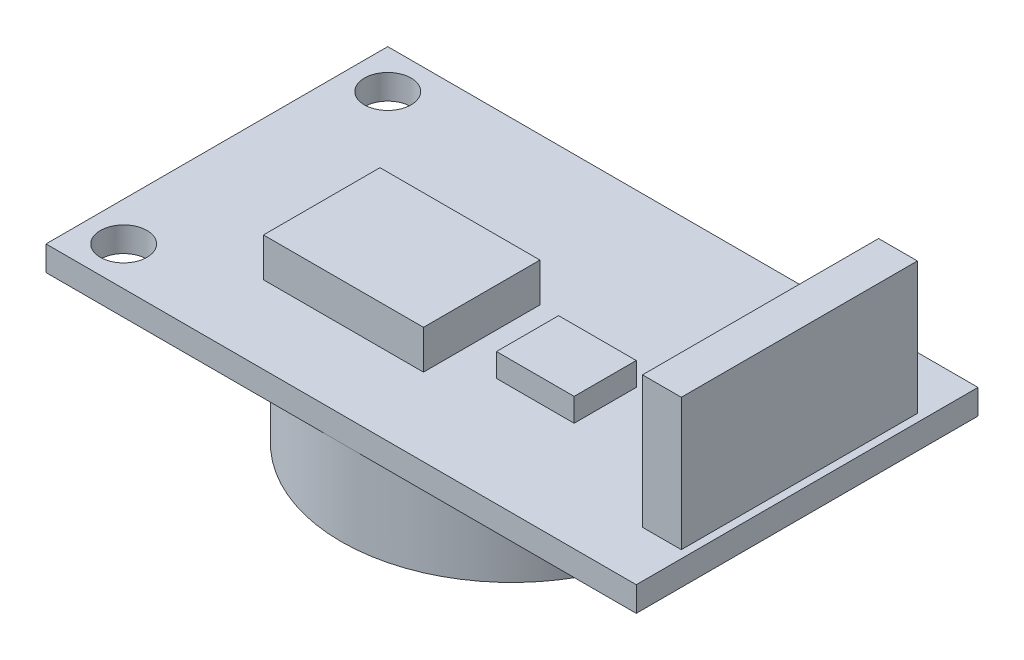
ISO-10303-21;
HEADER;
FILE_DESCRIPTION(('STEP AP214'),'2;1');
FILE_NAME('part.step','',(''),(''),'','','');
FILE_SCHEMA(('AUTOMOTIVE_DESIGN { 1 0 10303 214 1 1 1 1 }'));
ENDSEC;
DATA;
#1=APPLICATION_CONTEXT('core data for automotive mechanical design processes');
#2=APPLICATION_PROTOCOL_DEFINITION('international standard','automotive_design',2000,#1);
#3=PRODUCT_CONTEXT('',#1,'mechanical');
#4=PRODUCT('Part','Part','',(#3));
#5=PRODUCT_RELATED_PRODUCT_CATEGORY('part','',(#4));
#6=PRODUCT_DEFINITION_FORMATION('','',#4);
#7=PRODUCT_DEFINITION_CONTEXT('part definition',#1,'design');
#8=PRODUCT_DEFINITION('design','',#6,#7);
#9=PRODUCT_DEFINITION_SHAPE('','',#8);
#10=(LENGTH_UNIT() NAMED_UNIT(*) SI_UNIT(.MILLI.,.METRE.));
#11=(NAMED_UNIT(*) PLANE_ANGLE_UNIT() SI_UNIT($,.RADIAN.));
#12=(NAMED_UNIT(*) SI_UNIT($,.STERADIAN.) SOLID_ANGLE_UNIT());
#13=UNCERTAINTY_MEASURE_WITH_UNIT(LENGTH_MEASURE(1.E-05),#10,'distance_accuracy_value','');
#14=(GEOMETRIC_REPRESENTATION_CONTEXT(3) GLOBAL_UNCERTAINTY_ASSIGNED_CONTEXT((#13)) GLOBAL_UNIT_ASSIGNED_CONTEXT((#10,
#11,#12)) REPRESENTATION_CONTEXT('',''));
#15=CARTESIAN_POINT('',(0.,0.,0.));
#16=DIRECTION('',(0.,0.,1.));
#17=DIRECTION('',(1.,0.,0.));
#18=AXIS2_PLACEMENT_3D('',#15,#16,#17);
#19=CARTESIAN_POINT('',(0.,0.,0.));
#20=DIRECTION('',(0.,-1.,0.));
#21=DIRECTION('',(0.,0.,-1.));
#22=AXIS2_PLACEMENT_3D('',#19,#20,#21);
#23=PLANE('',#22);
#24=DIRECTION('',(1.,0.,0.));
#25=VECTOR('',#24,1.);
#26=CARTESIAN_POINT('',(0.,0.,0.));
#27=LINE('',#26,#25);
#28=CARTESIAN_POINT('',(19.,0.,0.));
#29=VERTEX_POINT('',#28);
#30=CARTESIAN_POINT('',(38.,0.,0.));
#31=VERTEX_POINT('',#30);
#32=EDGE_CURVE('E178',#29,#31,#27,.T.);
#33=ORIENTED_EDGE('',*,*,#32,.F.);
#34=CARTESIAN_POINT('',(19.,0.,-11.));
#35=DIRECTION('',(0.,1.,0.));
#36=DIRECTION('',(0.,0.,1.));
#37=AXIS2_PLACEMENT_3D('',#34,#35,#36);
#38=CIRCLE('',#37,11.);
#39=CARTESIAN_POINT('',(19.,0.,-22.));
#40=VERTEX_POINT('',#39);
#41=EDGE_CURVE('E62',#29,#40,#38,.T.);
#42=ORIENTED_EDGE('',*,*,#41,.T.);
#43=DIRECTION('',(-1.,0.,0.));
#44=VECTOR('',#43,1.);
#45=CARTESIAN_POINT('',(0.,0.,-22.));
#46=LINE('',#45,#44);
#47=CARTESIAN_POINT('',(38.,0.,-22.));
#48=VERTEX_POINT('',#47);
#49=EDGE_CURVE('E180',#48,#40,#46,.T.);
#50=ORIENTED_EDGE('',*,*,#49,.F.);
#51=DIRECTION('',(0.,0.,-1.));
#52=VECTOR('',#51,1.);
#53=CARTESIAN_POINT('',(38.,0.,0.));
#54=LINE('',#53,#52);
#55=EDGE_CURVE('E195',#31,#48,#54,.T.);
#56=ORIENTED_EDGE('',*,*,#55,.F.);
#57=EDGE_LOOP('',(#33,#42,#50,#56));
#58=FACE_BOUND('',#57,.T.);
#59=ADVANCED_FACE('F47',(#58),#23,.T.);
#60=CARTESIAN_POINT('',(0.,1.6,0.));
#61=DIRECTION('',(0.,-1.,0.));
#62=DIRECTION('',(0.,0.,-1.));
#63=AXIS2_PLACEMENT_3D('',#60,#61,#62);
#64=PLANE('',#63);
#65=DIRECTION('',(0.,0.,1.));
#66=VECTOR('',#65,1.);
#67=CARTESIAN_POINT('',(22.,1.6,-7.));
#68=LINE('',#67,#66);
#69=CARTESIAN_POINT('',(22.,1.6,-11.));
#70=VERTEX_POINT('',#69);
#71=CARTESIAN_POINT('',(22.,1.6,-7.));
#72=VERTEX_POINT('',#71);
#73=EDGE_CURVE('E677',#70,#72,#68,.T.);
#74=ORIENTED_EDGE('',*,*,#73,.F.);
#75=DIRECTION('',(-1.,0.,0.));
#76=VECTOR('',#75,1.);
#77=CARTESIAN_POINT('',(22.,1.6,-11.));
#78=LINE('',#77,#76);
#79=CARTESIAN_POINT('',(27.,1.6,-11.));
#80=VERTEX_POINT('',#79);
#81=EDGE_CURVE('E664',#80,#70,#78,.T.);
#82=ORIENTED_EDGE('',*,*,#81,.F.);
#83=DIRECTION('',(0.,0.,-1.));
#84=VECTOR('',#83,1.);
#85=CARTESIAN_POINT('',(27.,1.6,-7.));
#86=LINE('',#85,#84);
#87=CARTESIAN_POINT('',(27.,1.6,-7.));
#88=VERTEX_POINT('',#87);
#89=EDGE_CURVE('E667',#88,#80,#86,.T.);
#90=ORIENTED_EDGE('',*,*,#89,.F.);
#91=DIRECTION('',(1.,0.,0.));
#92=VECTOR('',#91,1.);
#93=CARTESIAN_POINT('',(22.,1.6,-7.));
#94=LINE('',#93,#92);
#95=EDGE_CURVE('E675',#72,#88,#94,.T.);
#96=ORIENTED_EDGE('',*,*,#95,.F.);
#97=EDGE_LOOP('',(#74,#82,#90,#96));
#98=FACE_BOUND('',#97,.T.);
#99=DIRECTION('',(0.,0.,1.));
#100=VECTOR('',#99,1.);
#101=CARTESIAN_POINT('',(0.,1.6,0.));
#102=LINE('',#101,#100);
#103=CARTESIAN_POINT('',(0.,1.6,-22.));
#104=VERTEX_POINT('',#103);
#105=CARTESIAN_POINT('',(0.,1.6,0.));
#106=VERTEX_POINT('',#105);
#107=EDGE_CURVE('E199',#104,#106,#102,.T.);
#108=ORIENTED_EDGE('',*,*,#107,.T.);
#109=DIRECTION('',(1.,0.,0.));
#110=VECTOR('',#109,1.);
#111=CARTESIAN_POINT('',(0.,1.6,0.));
#112=LINE('',#111,#110);
#113=CARTESIAN_POINT('',(38.,1.6,0.));
#114=VERTEX_POINT('',#113);
#115=EDGE_CURVE('E201',#106,#114,#112,.T.);
#116=ORIENTED_EDGE('',*,*,#115,.T.);
#117=DIRECTION('',(0.,0.,-1.));
#118=VECTOR('',#117,1.);
#119=CARTESIAN_POINT('',(38.,1.6,0.));
#120=LINE('',#119,#118);
#121=CARTESIAN_POINT('',(38.,1.6,-22.));
#122=VERTEX_POINT('',#121);
#123=EDGE_CURVE('E766',#114,#122,#120,.T.);
#124=ORIENTED_EDGE('',*,*,#123,.T.);
#125=DIRECTION('',(-1.,0.,0.));
#126=VECTOR('',#125,1.);
#127=CARTESIAN_POINT('',(0.,1.6,-22.));
#128=LINE('',#127,#126);
#129=EDGE_CURVE('E211',#122,#104,#128,.T.);
#130=ORIENTED_EDGE('',*,*,#129,.T.);
#131=EDGE_LOOP('',(#108,#116,#124,#130));
#132=FACE_BOUND('',#131,.T.);
#133=CARTESIAN_POINT('',(2.5,1.6,-19.5));
#134=DIRECTION('',(0.,1.,0.));
#135=DIRECTION('',(0.,0.,1.));
#136=AXIS2_PLACEMENT_3D('',#133,#134,#135);
#137=CIRCLE('',#136,1.5);
#138=CARTESIAN_POINT('',(2.5,1.6,-18.));
#139=VERTEX_POINT('',#138);
#140=EDGE_CURVE('E226',#139,#139,#137,.T.);
#141=ORIENTED_EDGE('',*,*,#140,.F.);
#142=EDGE_LOOP('',(#141));
#143=FACE_BOUND('',#142,.T.);
#144=CARTESIAN_POINT('',(2.5,1.6,-2.5));
#145=DIRECTION('',(0.,1.,0.));
#146=DIRECTION('',(0.,0.,1.));
#147=AXIS2_PLACEMENT_3D('',#144,#145,#146);
#148=CIRCLE('',#147,1.5);
#149=CARTESIAN_POINT('',(2.5,1.6,-1.));
#150=VERTEX_POINT('',#149);
#151=EDGE_CURVE('E240',#150,#150,#148,.T.);
#152=ORIENTED_EDGE('',*,*,#151,.F.);
#153=EDGE_LOOP('',(#152));
#154=FACE_BOUND('',#153,.T.);
#155=DIRECTION('',(0.,0.,1.));
#156=VECTOR('',#155,1.);
#157=CARTESIAN_POINT('',(9.,1.6,-5.));
#158=LINE('',#157,#156);
#159=CARTESIAN_POINT('',(9.,1.6,-12.5));
#160=VERTEX_POINT('',#159);
#161=CARTESIAN_POINT('',(9.,1.6,-5.));
#162=VERTEX_POINT('',#161);
#163=EDGE_CURVE('E632',#160,#162,#158,.T.);
#164=ORIENTED_EDGE('',*,*,#163,.F.);
#165=DIRECTION('',(-1.,0.,0.));
#166=VECTOR('',#165,1.);
#167=CARTESIAN_POINT('',(9.,1.6,-12.5));
#168=LINE('',#167,#166);
#169=CARTESIAN_POINT('',(19.3,1.6,-12.5));
#170=VERTEX_POINT('',#169);
#171=EDGE_CURVE('E618',#170,#160,#168,.T.);
#172=ORIENTED_EDGE('',*,*,#171,.F.);
#173=DIRECTION('',(0.,0.,-1.));
#174=VECTOR('',#173,1.);
#175=CARTESIAN_POINT('',(19.3,1.6,-5.));
#176=LINE('',#175,#174);
#177=CARTESIAN_POINT('',(19.3,1.6,-5.));
#178=VERTEX_POINT('',#177);
#179=EDGE_CURVE('E621',#178,#170,#176,.T.);
#180=ORIENTED_EDGE('',*,*,#179,.F.);
#181=DIRECTION('',(1.,0.,0.));
#182=VECTOR('',#181,1.);
#183=CARTESIAN_POINT('',(9.,1.6,-5.));
#184=LINE('',#183,#182);
#185=EDGE_CURVE('E630',#162,#178,#184,.T.);
#186=ORIENTED_EDGE('',*,*,#185,.F.);
#187=EDGE_LOOP('',(#164,#172,#180,#186));
#188=FACE_BOUND('',#187,.T.);
#189=DIRECTION('',(0.,0.,1.));
#190=VECTOR('',#189,1.);
#191=CARTESIAN_POINT('',(35.,1.6,-3.4));
#192=LINE('',#191,#190);
#193=CARTESIAN_POINT('',(35.,1.6,-18.6));
#194=VERTEX_POINT('',#193);
#195=CARTESIAN_POINT('',(35.,1.6,-3.4));
#196=VERTEX_POINT('',#195);
#197=EDGE_CURVE('E719',#194,#196,#192,.T.);
#198=ORIENTED_EDGE('',*,*,#197,.F.);
#199=DIRECTION('',(-1.,0.,0.));
#200=VECTOR('',#199,1.);
#201=CARTESIAN_POINT('',(35.,1.6,-18.6));
#202=LINE('',#201,#200);
#203=CARTESIAN_POINT('',(37.5,1.6,-18.6));
#204=VERTEX_POINT('',#203);
#205=EDGE_CURVE('E710',#204,#194,#202,.T.);
#206=ORIENTED_EDGE('',*,*,#205,.F.);
#207=DIRECTION('',(0.,0.,-1.));
#208=VECTOR('',#207,1.);
#209=CARTESIAN_POINT('',(37.5,1.6,-3.4));
#210=LINE('',#209,#208);
#211=CARTESIAN_POINT('',(37.5,1.6,-3.4));
#212=VERTEX_POINT('',#211);
#213=EDGE_CURVE('E715',#212,#204,#210,.T.);
#214=ORIENTED_EDGE('',*,*,#213,.F.);
#215=DIRECTION('',(1.,0.,0.));
#216=VECTOR('',#215,1.);
#217=CARTESIAN_POINT('',(35.,1.6,-3.4));
#218=LINE('',#217,#216);
#219=EDGE_CURVE('E73',#196,#212,#218,.T.);
#220=ORIENTED_EDGE('',*,*,#219,.F.);
#221=EDGE_LOOP('',(#198,#206,#214,#220));
#222=FACE_BOUND('',#221,.T.);
#223=ADVANCED_FACE('F260',(#98,#132,#143,#154,#188,#222),#64,.F.);
#224=CARTESIAN_POINT('',(2.5,0.,-2.5));
#225=DIRECTION('',(0.,-1.,0.));
#226=DIRECTION('',(0.,0.,-1.));
#227=AXIS2_PLACEMENT_3D('',#224,#225,#226);
#228=CIRCLE('',#227,1.5);
#229=CARTESIAN_POINT('',(2.5,0.,-4.));
#230=VERTEX_POINT('',#229);
#231=EDGE_CURVE('E232',#230,#230,#228,.T.);
#232=ORIENTED_EDGE('',*,*,#231,.F.);
#233=EDGE_LOOP('',(#232));
#234=FACE_BOUND('',#233,.T.);
#235=CARTESIAN_POINT('',(0.,0.,-22.));
#236=VERTEX_POINT('',#235);
#237=EDGE_CURVE('E181',#40,#236,#46,.T.);
#238=ORIENTED_EDGE('',*,*,#237,.F.);
#239=EDGE_CURVE('E11',#40,#29,#38,.T.);
#240=ORIENTED_EDGE('',*,*,#239,.T.);
#241=CARTESIAN_POINT('',(0.,0.,0.));
#242=VERTEX_POINT('',#241);
#243=EDGE_CURVE('E763',#242,#29,#27,.T.);
#244=ORIENTED_EDGE('',*,*,#243,.F.);
#245=DIRECTION('',(0.,0.,1.));
#246=VECTOR('',#245,1.);
#247=CARTESIAN_POINT('',(0.,0.,0.));
#248=LINE('',#247,#246);
#249=EDGE_CURVE('E190',#236,#242,#248,.T.);
#250=ORIENTED_EDGE('',*,*,#249,.F.);
#251=EDGE_LOOP('',(#238,#240,#244,#250));
#252=FACE_BOUND('',#251,.T.);
#253=CARTESIAN_POINT('',(2.5,0.,-18.));
#254=CARTESIAN_POINT('',(2.52473476852,0.,-17.9999980826802));
#255=CARTESIAN_POINT('',(2.54947077852716,0.,-18.0005895208856));
#256=CARTESIAN_POINT('',(2.59871128510739,0.,-18.0029702628292));
#257=CARTESIAN_POINT('',(2.62321619008211,0.,-18.0047511511846));
#258=CARTESIAN_POINT('',(2.67199479323806,0.,-18.0095103395863));
#259=CARTESIAN_POINT('',(2.6962690366817,0.,-18.0124830301223));
#260=CARTESIAN_POINT('',(2.74458604299784,0.,-18.0196223185799));
#261=CARTESIAN_POINT('',(2.76862920150763,0.,-18.023786237845));
#262=CARTESIAN_POINT('',(2.81648427918302,0.,-18.0333052012687));
#263=CARTESIAN_POINT('',(2.84029614420012,0.,-18.0386605176519));
#264=CARTESIAN_POINT('',(2.88768916254991,0.,-18.0505591453594));
#265=CARTESIAN_POINT('',(2.9112695224784,0.,-18.0571056152043));
#266=CARTESIAN_POINT('',(2.9582001930641,0.,-18.0713841370317));
#267=CARTESIAN_POINT('',(2.98154870748044,0.,-18.0791220881609));
#268=CARTESIAN_POINT('',(3.028017236187,0.,-18.0957791895752));
#269=CARTESIAN_POINT('',(3.05113423399122,0.,-18.1047067440334));
#270=CARTESIAN_POINT('',(3.09686336053341,0.,-18.1236328462025));
#271=CARTESIAN_POINT('',(3.11947652911205,0.,-18.1336288808047));
#272=CARTESIAN_POINT('',(3.16403406458057,0.,-18.1546460447498));
#273=CARTESIAN_POINT('',(3.18598193419839,0.,-18.1656597395946));
#274=CARTESIAN_POINT('',(3.22921011776657,0.,-18.1887078701629));
#275=CARTESIAN_POINT('',(3.25049296316425,0.,-18.200737556271));
#276=CARTESIAN_POINT('',(3.2923920024613,0.,-18.2258153814979));
#277=CARTESIAN_POINT('',(3.31300944998634,0.,-18.2388614255842));
#278=CARTESIAN_POINT('',(3.35357904909041,0.,-18.2659692031196));
#279=CARTESIAN_POINT('',(3.37353089224189,0.,-18.2800313981334));
#280=CARTESIAN_POINT('',(3.41277098771478,0.,-18.3091688454873));
#281=CARTESIAN_POINT('',(3.43205712992969,0.,-18.3242469388037));
#282=CARTESIAN_POINT('',(3.46996730836329,0.,-18.3554142625526));
#283=CARTESIAN_POINT('',(3.48858724864162,0.,-18.3715084726157));
#284=CARTESIAN_POINT('',(3.52516839349336,0.,-18.4047043306772));
#285=CARTESIAN_POINT('',(3.5431234128518,0.,-18.4218127889285));
#286=CARTESIAN_POINT('',(3.57814252919736,0.,-18.456812496153));
#287=CARTESIAN_POINT('',(3.59520921716565,0.,-18.4747011521589));
#288=CARTESIAN_POINT('',(3.62833220882851,0.,-18.5111697936336));
#289=CARTESIAN_POINT('',(3.64439459506989,0.,-18.5297442495727));
#290=CARTESIAN_POINT('',(3.67551206025717,0.,-18.5675806863676));
#291=CARTESIAN_POINT('',(3.69057129531407,0.,-18.5868392481338));
#292=CARTESIAN_POINT('',(3.71968410022349,0.,-18.6260421974699));
#293=CARTESIAN_POINT('',(3.73373963003835,0.,-18.645985129195));
#294=CARTESIAN_POINT('',(3.76084735271743,0.,-18.6865547656848));
#295=CARTESIAN_POINT('',(3.77389908400034,0.,-18.7071817788478));
#296=CARTESIAN_POINT('',(3.79900178729573,0.,-18.7491178039132));
#297=CARTESIAN_POINT('',(3.81104972262633,0.,-18.7704286330358));
#298=CARTESIAN_POINT('',(3.83414694196377,0.,-18.8137310828957));
#299=CARTESIAN_POINT('',(3.84519053619442,0.,-18.8357257367621));
#300=CARTESIAN_POINT('',(3.86628360233907,0.,-18.8803937086171));
#301=CARTESIAN_POINT('',(3.87632475368798,0.,-18.9030709514805));
#302=CARTESIAN_POINT('',(3.89528439042207,0.,-18.948807700282));
#303=CARTESIAN_POINT('',(3.90420626184726,0.,-18.9718658021565));
#304=CARTESIAN_POINT('',(3.92085197100997,0.,-19.01823405373));
#305=CARTESIAN_POINT('',(3.92858354434745,0.,-19.0415414224996));
#306=CARTESIAN_POINT('',(3.94285295603563,0.,-19.0884058704227));
#307=CARTESIAN_POINT('',(3.94939594256118,0.,-19.1119613812241));
#308=CARTESIAN_POINT('',(3.96129034794042,0.,-19.1593211718381));
#309=CARTESIAN_POINT('',(3.9666441346909,0.,-19.1831248566705));
#310=CARTESIAN_POINT('',(3.97616307710533,0.,-19.2309799898233));
#311=CARTESIAN_POINT('',(3.9803276883048,0.,-19.2550315464271));
#312=CARTESIAN_POINT('',(3.98747134007836,0.,-19.3033817703186));
#313=CARTESIAN_POINT('',(3.99044687970416,0.,-19.3276809544111));
#314=CARTESIAN_POINT('',(3.99521479776574,0.,-19.3765261247185));
#315=CARTESIAN_POINT('',(3.99700075880555,0.,-19.4010727357961));
#316=CARTESIAN_POINT('',(3.99939451810823,0.,-19.4504125277033));
#317=CARTESIAN_POINT('',(3.99999312718683,0.,-19.4752061505017));
#318=CARTESIAN_POINT('',(4.00000685149273,0.,-19.5247169354649));
#319=CARTESIAN_POINT('',(3.99942563232503,0.,-19.5494340962254));
#320=CARTESIAN_POINT('',(3.99705990065969,0.,-19.598642811929));
#321=CARTESIAN_POINT('',(3.99528359914018,0.,-19.6231347579143));
#322=CARTESIAN_POINT('',(3.99053256875276,0.,-19.6718925295955));
#323=CARTESIAN_POINT('',(3.98756319636062,0.,-19.6961588764443));
#324=CARTESIAN_POINT('',(3.98042838681365,0.,-19.744465409533));
#325=CARTESIAN_POINT('',(3.97626536499926,0.,-19.7685059522379));
#326=CARTESIAN_POINT('',(3.96674635445589,0.,-19.816361071839));
#327=CARTESIAN_POINT('',(3.96138982126907,0.,-19.8401755404186));
#328=CARTESIAN_POINT('',(3.94948686529562,0.,-19.8875790798446));
#329=CARTESIAN_POINT('',(3.9429370102819,0.,-19.9111672884015));
#330=CARTESIAN_POINT('',(3.92864975476398,0.,-19.9581189447596));
#331=CARTESIAN_POINT('',(3.92090618623437,0.,-19.9814805140276));
#332=CARTESIAN_POINT('',(3.90423621054066,0.,-20.0279805899351));
#333=CARTESIAN_POINT('',(3.89530114454309,0.,-20.0511159883522));
#334=CARTESIAN_POINT('',(3.87636686701958,0.,-20.0968632412828));
#335=CARTESIAN_POINT('',(3.86637104260849,0.,-20.1194764972651));
#336=CARTESIAN_POINT('',(3.84535403131573,0.,-20.1640340962111));
#337=CARTESIAN_POINT('',(3.83434028074335,0.,-20.1859819426558));
#338=CARTESIAN_POINT('',(3.81129210958862,0.,-20.229210109347));
#339=CARTESIAN_POINT('',(3.79926243830806,0.,-20.2504929609104));
#340=CARTESIAN_POINT('',(3.77418462391119,0.,-20.292392004711));
#341=CARTESIAN_POINT('',(3.76113857586527,0.,-20.3130094505895));
#342=CARTESIAN_POINT('',(3.73403079542929,0.,-20.3535790484874));
#343=CARTESIAN_POINT('',(3.71996860147678,0.,-20.3735308920802));
#344=CARTESIAN_POINT('',(3.69083115490272,0.,-20.4127709878773));
#345=CARTESIAN_POINT('',(3.67575306130075,0.,-20.4320571299735));
#346=CARTESIAN_POINT('',(3.64458573734164,0.,-20.4699673083196));
#347=CARTESIAN_POINT('',(3.62849152735564,0.,-20.4885872486299));
#348=CARTESIAN_POINT('',(3.5952956693512,0.,-20.5251683935053));
#349=CARTESIAN_POINT('',(3.57818721107903,0.,-20.543123412855));
#350=CARTESIAN_POINT('',(3.5431875038395,0.,-20.5781425291941));
#351=CARTESIAN_POINT('',(3.52529884783932,0.,-20.5952092171646));
#352=CARTESIAN_POINT('',(3.48883020636891,0.,-20.628332208829));
#353=CARTESIAN_POINT('',(3.47025575042847,0.,-20.6443945950697));
#354=CARTESIAN_POINT('',(3.43241931363263,0.,-20.6755120602564));
#355=CARTESIAN_POINT('',(3.41316075186691,0.,-20.6905712953134));
#356=CARTESIAN_POINT('',(3.37395780253116,0.,-20.7196841002229));
#357=CARTESIAN_POINT('',(3.35401487080599,0.,-20.7337396300377));
#358=CARTESIAN_POINT('',(3.31344523431614,0.,-20.7608473527167));
#359=CARTESIAN_POINT('',(3.29281822115309,0.,-20.7738990839997));
#360=CARTESIAN_POINT('',(3.25088219608766,0.,-20.7990017872951));
#361=CARTESIAN_POINT('',(3.22957136696504,0.,-20.8110497226258));
#362=CARTESIAN_POINT('',(3.18626891710494,0.,-20.8341469419633));
#363=CARTESIAN_POINT('',(3.16427426323847,0.,-20.845190536194));
#364=CARTESIAN_POINT('',(3.11960629138316,0.,-20.8662836023389));
#365=CARTESIAN_POINT('',(3.09692904851967,0.,-20.8763247536879));
#366=CARTESIAN_POINT('',(3.05119229971807,0.,-20.8952843904221));
#367=CARTESIAN_POINT('',(3.02813419784369,0.,-20.9042062618473));
#368=CARTESIAN_POINT('',(2.98176594627034,0.,-20.92085197101));
#369=CARTESIAN_POINT('',(2.95845857750085,0.,-20.9285835443475));
#370=CARTESIAN_POINT('',(2.91159412957785,0.,-20.9428529560356));
#371=CARTESIAN_POINT('',(2.88803861877647,0.,-20.9493959425612));
#372=CARTESIAN_POINT('',(2.84067882816255,0.,-20.9612903479404));
#373=CARTESIAN_POINT('',(2.81687514333016,0.,-20.9666441346909));
#374=CARTESIAN_POINT('',(2.76902001017735,0.,-20.9761630771053));
#375=CARTESIAN_POINT('',(2.7449684535735,0.,-20.9803276883048));
#376=CARTESIAN_POINT('',(2.69661822968193,0.,-20.9874713400784));
#377=CARTESIAN_POINT('',(2.67231904558947,0.,-20.9904468797042));
#378=CARTESIAN_POINT('',(2.62347387528196,0.,-20.9952147977657));
#379=CARTESIAN_POINT('',(2.59892726420421,0.,-20.9970007588055));
#380=CARTESIAN_POINT('',(2.54958747229691,0.,-20.9993945181082));
#381=CARTESIAN_POINT('',(2.52479384949843,0.,-20.9999931271868));
#382=CARTESIAN_POINT('',(2.4752830645351,0.,-21.0000068514927));
#383=CARTESIAN_POINT('',(2.45056590377459,0.,-20.999425632325));
#384=CARTESIAN_POINT('',(2.40135718807092,0.,-20.9970599006597));
#385=CARTESIAN_POINT('',(2.37686524208567,0.,-20.9952835991402));
#386=CARTESIAN_POINT('',(2.32810747040439,0.,-20.9905325687528));
#387=CARTESIAN_POINT('',(2.30384112355559,0.,-20.9875631963606));
#388=CARTESIAN_POINT('',(2.25553459046684,0.,-20.9804283868137));
#389=CARTESIAN_POINT('',(2.23149404776201,0.,-20.9762653649993));
#390=CARTESIAN_POINT('',(2.18363892816088,0.,-20.9667463544559));
#391=CARTESIAN_POINT('',(2.15982445958129,0.,-20.9613898212691));
#392=CARTESIAN_POINT('',(2.11242092015526,0.,-20.9494868652956));
#393=CARTESIAN_POINT('',(2.0888327115984,0.,-20.9429370102819));
#394=CARTESIAN_POINT('',(2.04188105524034,0.,-20.928649754764));
#395=CARTESIAN_POINT('',(2.01851948597238,0.,-20.9209061862344));
#396=CARTESIAN_POINT('',(1.97201941006483,0.,-20.9042362105407));
#397=CARTESIAN_POINT('',(1.94888401164777,0.,-20.8953011445431));
#398=CARTESIAN_POINT('',(1.90313675871714,0.,-20.8763668670195));
#399=CARTESIAN_POINT('',(1.88052350273471,0.,-20.8663710426084));
#400=CARTESIAN_POINT('',(1.8359659037886,0.,-20.8453540313156));
#401=CARTESIAN_POINT('',(1.81401805734381,0.,-20.8343402807432));
#402=CARTESIAN_POINT('',(1.77078989065249,0.,-20.8112921095884));
#403=CARTESIAN_POINT('',(1.74950703908904,0.,-20.7992624383078));
#404=CARTESIAN_POINT('',(1.70760799528844,0.,-20.7741846239109));
#405=CARTESIAN_POINT('',(1.68699054940992,0.,-20.761138575865));
#406=CARTESIAN_POINT('',(1.64642095151201,0.,-20.734030795429));
#407=CARTESIAN_POINT('',(1.62646910791921,0.,-20.7199686014765));
#408=CARTESIAN_POINT('',(1.58722901212215,0.,-20.6908311549025));
#409=CARTESIAN_POINT('',(1.56794287002603,0.,-20.6757530613005));
#410=CARTESIAN_POINT('',(1.53003269168004,0.,-20.6445857373415));
#411=CARTESIAN_POINT('',(1.51141275136973,0.,-20.6284915273555));
#412=CARTESIAN_POINT('',(1.47483160649452,0.,-20.5952956693511));
#413=CARTESIAN_POINT('',(1.45687658714491,0.,-20.578187211079));
#414=CARTESIAN_POINT('',(1.42185747080579,0.,-20.5431875038393));
#415=CARTESIAN_POINT('',(1.40479078283516,0.,-20.525298847839));
#416=CARTESIAN_POINT('',(1.3716677911706,0.,-20.4888302063683));
#417=CARTESIAN_POINT('',(1.35560540492982,0.,-20.4702557504278));
#418=CARTESIAN_POINT('',(1.32448793974297,0.,-20.4324193136317));
#419=CARTESIAN_POINT('',(1.30942870468589,0.,-20.4131607518659));
#420=CARTESIAN_POINT('',(1.28031589977634,0.,-20.3739578025301));
#421=CARTESIAN_POINT('',(1.26626036996153,0.,-20.3540148708049));
#422=CARTESIAN_POINT('',(1.23915264728248,0.,-20.3134452343151));
#423=CARTESIAN_POINT('',(1.22610091599956,0.,-20.292818221152));
#424=CARTESIAN_POINT('',(1.20099821270418,0.,-20.2508821960867));
#425=CARTESIAN_POINT('',(1.18895027737359,0.,-20.2295713669642));
#426=CARTESIAN_POINT('',(1.16585305803616,0.,-20.1862689171042));
#427=CARTESIAN_POINT('',(1.15480946380552,0.,-20.1642742632379));
#428=CARTESIAN_POINT('',(1.1337163976609,0.,-20.1196062913828));
#429=CARTESIAN_POINT('',(1.12367524631201,0.,-20.0969290485195));
#430=CARTESIAN_POINT('',(1.10471560957792,0.,-20.0511922997179));
#431=CARTESIAN_POINT('',(1.09579373815272,0.,-20.0281341978434));
#432=CARTESIAN_POINT('',(1.07914802899,0.,-19.9817659462698));
#433=CARTESIAN_POINT('',(1.07141645565251,0.,-19.9584585775002));
#434=CARTESIAN_POINT('',(1.05714704396432,0.,-19.9115941295771));
#435=CARTESIAN_POINT('',(1.05060405743877,0.,-19.8880386187756));
#436=CARTESIAN_POINT('',(1.03870965205952,0.,-19.8406788281616));
#437=CARTESIAN_POINT('',(1.03335586530904,0.,-19.8168751433292));
#438=CARTESIAN_POINT('',(1.02383692289461,0.,-19.7690200101764));
#439=CARTESIAN_POINT('',(1.01967231169514,0.,-19.7449684535726));
#440=CARTESIAN_POINT('',(1.01252865992158,0.,-19.6966182296811));
#441=CARTESIAN_POINT('',(1.00955312029579,0.,-19.6723190455887));
#442=CARTESIAN_POINT('',(1.00478520223422,0.,-19.6234738752813));
#443=CARTESIAN_POINT('',(1.00299924119442,0.,-19.5989272642037));
#444=CARTESIAN_POINT('',(1.00060548189175,0.,-19.5495874722966));
#445=CARTESIAN_POINT('',(1.00000687281316,0.,-19.5247938494983));
#446=CARTESIAN_POINT('',(0.999993148507278,0.,-19.4752830645351));
#447=CARTESIAN_POINT('',(1.00057436767499,0.,-19.4505659037746));
#448=CARTESIAN_POINT('',(1.00294009934035,0.,-19.4013571880709));
#449=CARTESIAN_POINT('',(1.00471640085986,0.,-19.3768652420856));
#450=CARTESIAN_POINT('',(1.00946743124729,0.,-19.3281074704044));
#451=CARTESIAN_POINT('',(1.01243680363943,0.,-19.3038411235556));
#452=CARTESIAN_POINT('',(1.01957161318641,0.,-19.2555345904668));
#453=CARTESIAN_POINT('',(1.02373463500081,0.,-19.231494047762));
#454=CARTESIAN_POINT('',(1.03325364554417,0.,-19.1836389281608));
#455=CARTESIAN_POINT('',(1.03861017873099,0.,-19.1598244595813));
#456=CARTESIAN_POINT('',(1.05051313470444,0.,-19.1124209201552));
#457=CARTESIAN_POINT('',(1.05706298971815,0.,-19.0888327115984));
#458=CARTESIAN_POINT('',(1.07135024523606,0.,-19.0418810552403));
#459=CARTESIAN_POINT('',(1.07909381376566,0.,-19.0185194859724));
#460=CARTESIAN_POINT('',(1.09576378945936,0.,-18.9720194100648));
#461=CARTESIAN_POINT('',(1.10469885545692,0.,-18.9488840116478));
#462=CARTESIAN_POINT('',(1.12363313298042,0.,-18.9031367587172));
#463=CARTESIAN_POINT('',(1.13362895739151,0.,-18.8805235027349));
#464=CARTESIAN_POINT('',(1.15464596868429,0.,-18.8359659037889));
#465=CARTESIAN_POINT('',(1.16565971925667,0.,-18.8140180573442));
#466=CARTESIAN_POINT('',(1.18870789041139,0.,-18.7707898906529));
#467=CARTESIAN_POINT('',(1.20073756169196,0.,-18.7495070390895));
#468=CARTESIAN_POINT('',(1.22581537608883,0.,-18.707607995289));
#469=CARTESIAN_POINT('',(1.23886142413477,0.,-18.6869905494105));
#470=CARTESIAN_POINT('',(1.26596920457071,0.,-18.6464209515125));
#471=CARTESIAN_POINT('',(1.28003139852318,0.,-18.6264691079196));
#472=CARTESIAN_POINT('',(1.30916884509736,0.,-18.5872290121228));
#473=CARTESIAN_POINT('',(1.3242469386995,0.,-18.567942870027));
#474=CARTESIAN_POINT('',(1.35541426265814,0.,-18.5300326916799));
#475=CARTESIAN_POINT('',(1.37150847264352,0.,-18.511412751368));
#476=CARTESIAN_POINT('',(1.40470433064966,0.,-18.4748316064967));
#477=CARTESIAN_POINT('',(1.42181278892419,0.,-18.4568765871527));
#478=CARTESIAN_POINT('',(1.45681249615729,0.,-18.4218574707982));
#479=CARTESIAN_POINT('',(1.47470115214872,0.,-18.4047907828068));
#480=CARTESIAN_POINT('',(1.51116979364294,0.,-18.3716677911995));
#481=CARTESIAN_POINT('',(1.52974424961565,0.,-18.3556054050362));
#482=CARTESIAN_POINT('',(1.5675806863234,0.,-18.3244879396383));
#483=CARTESIAN_POINT('',(1.58683924796945,0.,-18.3094287042942));
#484=CARTESIAN_POINT('',(1.62604219763209,0.,-18.2803159001688));
#485=CARTESIAN_POINT('',(1.64598512980268,0.,-18.2662603714223));
#486=CARTESIAN_POINT('',(1.68655476507485,0.,-18.2391526458227));
#487=CARTESIAN_POINT('',(1.70718177657382,0.,-18.2261009105487));
#488=CARTESIAN_POINT('',(1.74911780619201,0.,-18.2009982181725));
#489=CARTESIAN_POINT('',(1.7704286415545,0.,-18.1889502978075));
#490=CARTESIAN_POINT('',(1.81373107432987,0.,-18.1658530374941));
#491=CARTESIAN_POINT('',(1.83572570471333,0.,-18.1548093869419));
#492=CARTESIAN_POINT('',(1.88039374091209,0.,-18.1337164751178));
#493=CARTESIAN_POINT('',(1.90307107246158,0.,-18.1236755364724));
#494=CARTESIAN_POINT('',(1.94882597408152,0.,-18.1047076948578));
#495=CARTESIAN_POINT('',(1.97190250413218,0.,-18.0957782837642));
#496=CARTESIAN_POINT('',(2.01830235185494,0.,-18.079119653852));
#497=CARTESIAN_POINT('',(2.04162279569822,0.,-18.0713824418994));
#498=CARTESIAN_POINT('',(2.08850826062961,0.,-18.0571042684096));
#499=CARTESIAN_POINT('',(2.11207163070014,0.,-18.0505578885187));
#500=CARTESIAN_POINT('',(2.15944196283151,0.,-18.0386591292703));
#501=CARTESIAN_POINT('',(2.18324826081577,0.,-18.0333041075351));
#502=CARTESIAN_POINT('',(2.23110342111008,0.,-18.0237851564261));
#503=CARTESIAN_POINT('',(2.25515233756607,0.,-18.0196214993058));
#504=CARTESIAN_POINT('',(2.30349212816771,0.,-18.0124821979409));
#505=CARTESIAN_POINT('',(2.32778348027975,0.,-18.0095097916543));
#506=CARTESIAN_POINT('',(2.376607576954,0.,-18.0047506011437));
#507=CARTESIAN_POINT('',(2.40114092052276,0.,-18.0029699870246));
#508=CARTESIAN_POINT('',(2.45044966261437,0.,-18.000589256812));
#509=CARTESIAN_POINT('',(2.47522549562086,0.,-17.9999981034953));
#510=CARTESIAN_POINT('',(2.5,0.,-18.));
#511=B_SPLINE_CURVE_WITH_KNOTS('',3,(#253,#254,#255,#256,#257,#258,#259,#260,#261,#262,#263,
#264,#265,#266,#267,#268,#269,#270,#271,#272,#273,#274,#275,#276,#277,#278,#279,#280,#281,#282,
#283,#284,#285,#286,#287,#288,#289,#290,#291,#292,#293,#294,#295,#296,#297,#298,#299,#300,#301,
#302,#303,#304,#305,#306,#307,#308,#309,#310,#311,#312,#313,#314,#315,#316,#317,#318,#319,#320,
#321,#322,#323,#324,#325,#326,#327,#328,#329,#330,#331,#332,#333,#334,#335,#336,#337,#338,#339,
#340,#341,#342,#343,#344,#345,#346,#347,#348,#349,#350,#351,#352,#353,#354,#355,#356,#357,#358,
#359,#360,#361,#362,#363,#364,#365,#366,#367,#368,#369,#370,#371,#372,#373,#374,#375,#376,#377,
#378,#379,#380,#381,#382,#383,#384,#385,#386,#387,#388,#389,#390,#391,#392,#393,#394,#395,#396,
#397,#398,#399,#400,#401,#402,#403,#404,#405,#406,#407,#408,#409,#410,#411,#412,#413,#414,#415,
#416,#417,#418,#419,#420,#421,#422,#423,#424,#425,#426,#427,#428,#429,#430,#431,#432,#433,#434,
#435,#436,#437,#438,#439,#440,#441,#442,#443,#444,#445,#446,#447,#448,#449,#450,#451,#452,#453,
#454,#455,#456,#457,#458,#459,#460,#461,#462,#463,#464,#465,#466,#467,#468,#469,#470,#471,#472,
#473,#474,#475,#476,#477,#478,#479,#480,#481,#482,#483,#484,#485,#486,#487,#488,#489,#490,#491,
#492,#493,#494,#495,#496,#497,#498,#499,#500,#501,#502,#503,#504,#505,#506,#507,#508,#509,#510),
.UNSPECIFIED.,.F.,.F.,(4,2,2,2,2,2,2,2,2,2,2,2,2,2,2,2,2,2,2,2,2,2,2,2,2,2,2,2,2,2,2,2,2,2,2,2,
2,2,2,2,2,2,2,2,2,2,2,2,2,2,2,2,2,2,2,2,2,2,2,2,2,2,2,2,2,2,2,2,2,2,2,2,2,2,2,2,2,2,2,2,2,2,2,2,
2,2,2,2,2,2,2,2,2,2,2,2,2,2,2,2,2,2,2,2,2,2,2,2,2,2,2,2,2,2,2,2,2,2,2,2,2,2,2,2,2,2,2,2,4),(0.,
0.0741989708044316,0.147878466157727,0.22121516744073,0.294388239175523,0.367578047561761,
0.440964835395815,0.514727401498565,0.589041832398639,0.663185166528662,0.736824221437052,
0.810136292193568,0.883301050980423,0.956499254762978,1.02991141346008,1.10371646715607,
1.17809052013485,1.25223385426531,1.32587290917402,1.39918497993074,1.47234973871766,
1.54554794250015,1.61896010119705,1.69276515489269,1.76713920787098,1.84128254200126,
1.91492159690984,1.98823366766648,2.06139842645337,2.13459663023589,2.20800878893286,
2.28181384262864,2.35618789560712,2.43033122973738,2.50397028464595,2.57728235540257,
2.65044711418946,2.72364531797198,2.79705747666897,2.87086253036476,2.94523658334327,
3.01937991747346,3.09301897238199,3.16633104313858,3.23949580192547,3.31269400570799,
3.386106164405,3.45991121810084,3.5342852710794,3.60842860520934,3.68206766011768,
3.75537973087417,3.82854448966102,3.90174269344358,3.9751548521407,4.04895990583671,
4.12333395881552,4.19747729294554,4.27111634785393,4.34442841861044,4.4175931773973,
4.49079138117985,4.56420353987695,4.63800859357293,4.71238264655169,4.786525980682,
4.86016503559061,4.93347710634725,5.00664186513415,5.07984006891666,5.15325222761363,
5.22705728130939,5.30143133428785,5.37557466841834,5.44921372332707,5.5225257940838,
5.59569055287073,5.66888875665321,5.74230091535009,5.81610596904572,5.890480022024,
5.96462335615453,6.03826241106329,6.11157448182003,6.18473924060696,6.25793744438943,
6.33134960308631,6.40515465678191,6.47952870976014,6.55367204389055,6.62731109879923,
6.70062316955592,6.77378792834283,6.84698613212533,6.92039829082225,6.99420334451792,
7.06857739749627,7.1427207316266,7.21635978653521,7.28967185729187,7.36283661607877,
7.43603481986128,7.50944697855824,7.58325203225398,7.65762608523241,7.73176941936264,
7.80540847427117,7.87872054502778,7.95188530381467,8.02508350759719,8.0984956662942,
8.17230071999001,8.24667477296855,8.32081810709846,8.39445716200678,8.46776923276325,
8.5409339915501,8.61413219533266,8.6875443540298,8.76134940772583,8.83572346070467,
8.90992652587263,8.98360814499196,9.05694563133159,9.13011879991152,9.20330867686376,
9.27669616467595,9.35046071196887,9.42477903607618),.UNSPECIFIED.);
#512=CARTESIAN_POINT('',(2.5,0.,-18.));
#513=VERTEX_POINT('',#512);
#514=EDGE_CURVE('E225',#513,#513,#511,.T.);
#515=ORIENTED_EDGE('',*,*,#514,.T.);
#516=EDGE_LOOP('',(#515));
#517=FACE_BOUND('',#516,.T.);
#518=ADVANCED_FACE('F184',(#234,#252,#517),#23,.T.);
#519=CARTESIAN_POINT('',(0.,1.6,0.));
#520=DIRECTION('',(1.,0.,0.));
#521=DIRECTION('',(0.,0.,-1.));
#522=AXIS2_PLACEMENT_3D('',#519,#520,#521);
#523=PLANE('',#522);
#524=ORIENTED_EDGE('',*,*,#249,.T.);
#525=DIRECTION('',(0.,-1.,0.));
#526=VECTOR('',#525,1.);
#527=CARTESIAN_POINT('',(0.,1.6,0.));
#528=LINE('',#527,#526);
#529=EDGE_CURVE('E61',#106,#242,#528,.T.);
#530=ORIENTED_EDGE('',*,*,#529,.F.);
#531=ORIENTED_EDGE('',*,*,#107,.F.);
#532=DIRECTION('',(0.,-1.,0.));
#533=VECTOR('',#532,1.);
#534=CARTESIAN_POINT('',(0.,1.6,-22.));
#535=LINE('',#534,#533);
#536=EDGE_CURVE('E208',#104,#236,#535,.T.);
#537=ORIENTED_EDGE('',*,*,#536,.T.);
#538=EDGE_LOOP('',(#524,#530,#531,#537));
#539=FACE_BOUND('',#538,.T.);
#540=ADVANCED_FACE('F51',(#539),#523,.F.);
#541=CARTESIAN_POINT('',(0.,1.6,0.));
#542=DIRECTION('',(0.,0.,-1.));
#543=DIRECTION('',(-1.,0.,0.));
#544=AXIS2_PLACEMENT_3D('',#541,#542,#543);
#545=PLANE('',#544);
#546=ORIENTED_EDGE('',*,*,#243,.T.);
#547=ORIENTED_EDGE('',*,*,#32,.T.);
#548=DIRECTION('',(0.,-1.,0.));
#549=VECTOR('',#548,1.);
#550=CARTESIAN_POINT('',(38.,1.6,0.));
#551=LINE('',#550,#549);
#552=EDGE_CURVE('E212',#114,#31,#551,.T.);
#553=ORIENTED_EDGE('',*,*,#552,.F.);
#554=ORIENTED_EDGE('',*,*,#115,.F.);
#555=ORIENTED_EDGE('',*,*,#529,.T.);
#556=EDGE_LOOP('',(#546,#547,#553,#554,#555));
#557=FACE_BOUND('',#556,.T.);
#558=ADVANCED_FACE('F268',(#557),#545,.F.);
#559=CARTESIAN_POINT('',(38.,1.6,0.));
#560=DIRECTION('',(-1.,0.,0.));
#561=DIRECTION('',(0.,0.,1.));
#562=AXIS2_PLACEMENT_3D('',#559,#560,#561);
#563=PLANE('',#562);
#564=ORIENTED_EDGE('',*,*,#55,.T.);
#565=DIRECTION('',(0.,-1.,0.));
#566=VECTOR('',#565,1.);
#567=CARTESIAN_POINT('',(38.,1.6,-22.));
#568=LINE('',#567,#566);
#569=EDGE_CURVE('E196',#122,#48,#568,.T.);
#570=ORIENTED_EDGE('',*,*,#569,.F.);
#571=ORIENTED_EDGE('',*,*,#123,.F.);
#572=ORIENTED_EDGE('',*,*,#552,.T.);
#573=EDGE_LOOP('',(#564,#570,#571,#572));
#574=FACE_BOUND('',#573,.T.);
#575=ADVANCED_FACE('F266',(#574),#563,.F.);
#576=CARTESIAN_POINT('',(0.,1.6,-22.));
#577=DIRECTION('',(0.,0.,1.));
#578=DIRECTION('',(1.,0.,0.));
#579=AXIS2_PLACEMENT_3D('',#576,#577,#578);
#580=PLANE('',#579);
#581=ORIENTED_EDGE('',*,*,#49,.T.);
#582=ORIENTED_EDGE('',*,*,#237,.T.);
#583=ORIENTED_EDGE('',*,*,#536,.F.);
#584=ORIENTED_EDGE('',*,*,#129,.F.);
#585=ORIENTED_EDGE('',*,*,#569,.T.);
#586=EDGE_LOOP('',(#581,#582,#583,#584,#585));
#587=FACE_BOUND('',#586,.T.);
#588=ADVANCED_FACE('F191',(#587),#580,.F.);
#589=CARTESIAN_POINT('',(2.5,-1.2E-05,-19.5));
#590=DIRECTION('',(0.,1.,0.));
#591=DIRECTION('',(0.,0.,1.));
#592=AXIS2_PLACEMENT_3D('',#589,#590,#591);
#593=CYLINDRICAL_SURFACE('',#592,1.5);
#594=ORIENTED_EDGE('',*,*,#514,.F.);
#595=EDGE_LOOP('',(#594));
#596=FACE_BOUND('',#595,.T.);
#597=ORIENTED_EDGE('',*,*,#140,.T.);
#598=EDGE_LOOP('',(#597));
#599=FACE_BOUND('',#598,.T.);
#600=ADVANCED_FACE('F244',(#596,#599),#593,.F.);
#601=CARTESIAN_POINT('',(2.5,-0.0788340793951551,-2.5));
#602=DIRECTION('',(0.,1.,0.));
#603=DIRECTION('',(0.,0.,1.));
#604=AXIS2_PLACEMENT_3D('',#601,#602,#603);
#605=CYLINDRICAL_SURFACE('',#604,1.5);
#606=ORIENTED_EDGE('',*,*,#231,.T.);
#607=EDGE_LOOP('',(#606));
#608=FACE_BOUND('',#607,.T.);
#609=ORIENTED_EDGE('',*,*,#151,.T.);
#610=EDGE_LOOP('',(#609));
#611=FACE_BOUND('',#610,.T.);
#612=ADVANCED_FACE('F254',(#608,#611),#605,.F.);
#613=CARTESIAN_POINT('',(9.,4.1,-5.));
#614=DIRECTION('',(1.,0.,0.));
#615=DIRECTION('',(0.,0.,-1.));
#616=AXIS2_PLACEMENT_3D('',#613,#614,#615);
#617=PLANE('',#616);
#618=ORIENTED_EDGE('',*,*,#163,.T.);
#619=DIRECTION('',(0.,-1.,0.));
#620=VECTOR('',#619,1.);
#621=CARTESIAN_POINT('',(9.,4.1,-5.));
#622=LINE('',#621,#620);
#623=CARTESIAN_POINT('',(9.,4.1,-5.));
#624=VERTEX_POINT('',#623);
#625=EDGE_CURVE('E599',#624,#162,#622,.T.);
#626=ORIENTED_EDGE('',*,*,#625,.F.);
#627=DIRECTION('',(0.,0.,1.));
#628=VECTOR('',#627,1.);
#629=CARTESIAN_POINT('',(9.,4.1,-5.));
#630=LINE('',#629,#628);
#631=CARTESIAN_POINT('',(9.,4.1,-12.5));
#632=VERTEX_POINT('',#631);
#633=EDGE_CURVE('E625',#632,#624,#630,.T.);
#634=ORIENTED_EDGE('',*,*,#633,.F.);
#635=DIRECTION('',(0.,-1.,0.));
#636=VECTOR('',#635,1.);
#637=CARTESIAN_POINT('',(9.,4.1,-12.5));
#638=LINE('',#637,#636);
#639=EDGE_CURVE('E612',#632,#160,#638,.T.);
#640=ORIENTED_EDGE('',*,*,#639,.T.);
#641=EDGE_LOOP('',(#618,#626,#634,#640));
#642=FACE_BOUND('',#641,.T.);
#643=ADVANCED_FACE('F314',(#642),#617,.F.);
#644=CARTESIAN_POINT('',(9.,4.1,-5.));
#645=DIRECTION('',(0.,0.,-1.));
#646=DIRECTION('',(-1.,0.,0.));
#647=AXIS2_PLACEMENT_3D('',#644,#645,#646);
#648=PLANE('',#647);
#649=ORIENTED_EDGE('',*,*,#185,.T.);
#650=DIRECTION('',(0.,-1.,0.));
#651=VECTOR('',#650,1.);
#652=CARTESIAN_POINT('',(19.3,4.1,-5.));
#653=LINE('',#652,#651);
#654=CARTESIAN_POINT('',(19.3,4.1,-5.));
#655=VERTEX_POINT('',#654);
#656=EDGE_CURVE('E602',#655,#178,#653,.T.);
#657=ORIENTED_EDGE('',*,*,#656,.F.);
#658=DIRECTION('',(1.,0.,0.));
#659=VECTOR('',#658,1.);
#660=CARTESIAN_POINT('',(9.,4.1,-5.));
#661=LINE('',#660,#659);
#662=EDGE_CURVE('E643',#624,#655,#661,.T.);
#663=ORIENTED_EDGE('',*,*,#662,.F.);
#664=ORIENTED_EDGE('',*,*,#625,.T.);
#665=EDGE_LOOP('',(#649,#657,#663,#664));
#666=FACE_BOUND('',#665,.T.);
#667=ADVANCED_FACE('F318',(#666),#648,.F.);
#668=CARTESIAN_POINT('',(19.3,4.1,-5.));
#669=DIRECTION('',(-1.,0.,0.));
#670=DIRECTION('',(0.,0.,1.));
#671=AXIS2_PLACEMENT_3D('',#668,#669,#670);
#672=PLANE('',#671);
#673=ORIENTED_EDGE('',*,*,#179,.T.);
#674=DIRECTION('',(0.,-1.,0.));
#675=VECTOR('',#674,1.);
#676=CARTESIAN_POINT('',(19.3,4.1,-12.5));
#677=LINE('',#676,#675);
#678=CARTESIAN_POINT('',(19.3,4.1,-12.5));
#679=VERTEX_POINT('',#678);
#680=EDGE_CURVE('E606',#679,#170,#677,.T.);
#681=ORIENTED_EDGE('',*,*,#680,.F.);
#682=DIRECTION('',(0.,0.,-1.));
#683=VECTOR('',#682,1.);
#684=CARTESIAN_POINT('',(19.3,4.1,-5.));
#685=LINE('',#684,#683);
#686=EDGE_CURVE('E636',#655,#679,#685,.T.);
#687=ORIENTED_EDGE('',*,*,#686,.F.);
#688=ORIENTED_EDGE('',*,*,#656,.T.);
#689=EDGE_LOOP('',(#673,#681,#687,#688));
#690=FACE_BOUND('',#689,.T.);
#691=ADVANCED_FACE('F327',(#690),#672,.F.);
#692=CARTESIAN_POINT('',(9.,4.1,-12.5));
#693=DIRECTION('',(0.,0.,1.));
#694=DIRECTION('',(1.,0.,0.));
#695=AXIS2_PLACEMENT_3D('',#692,#693,#694);
#696=PLANE('',#695);
#697=ORIENTED_EDGE('',*,*,#171,.T.);
#698=ORIENTED_EDGE('',*,*,#639,.F.);
#699=DIRECTION('',(-1.,0.,0.));
#700=VECTOR('',#699,1.);
#701=CARTESIAN_POINT('',(9.,4.1,-12.5));
#702=LINE('',#701,#700);
#703=EDGE_CURVE('E620',#679,#632,#702,.T.);
#704=ORIENTED_EDGE('',*,*,#703,.F.);
#705=ORIENTED_EDGE('',*,*,#680,.T.);
#706=EDGE_LOOP('',(#697,#698,#704,#705));
#707=FACE_BOUND('',#706,.T.);
#708=ADVANCED_FACE('F337',(#707),#696,.F.);
#709=CARTESIAN_POINT('',(0.,4.1,0.));
#710=DIRECTION('',(0.,-1.,0.));
#711=DIRECTION('',(0.,0.,-1.));
#712=AXIS2_PLACEMENT_3D('',#709,#710,#711);
#713=PLANE('',#712);
#714=ORIENTED_EDGE('',*,*,#633,.T.);
#715=ORIENTED_EDGE('',*,*,#662,.T.);
#716=ORIENTED_EDGE('',*,*,#686,.T.);
#717=ORIENTED_EDGE('',*,*,#703,.T.);
#718=EDGE_LOOP('',(#714,#715,#716,#717));
#719=FACE_BOUND('',#718,.T.);
#720=ADVANCED_FACE('F346',(#719),#713,.F.);
#721=CARTESIAN_POINT('',(22.,3.1,-7.));
#722=DIRECTION('',(1.,0.,0.));
#723=DIRECTION('',(0.,0.,-1.));
#724=AXIS2_PLACEMENT_3D('',#721,#722,#723);
#725=PLANE('',#724);
#726=ORIENTED_EDGE('',*,*,#73,.T.);
#727=DIRECTION('',(0.,-1.,0.));
#728=VECTOR('',#727,1.);
#729=CARTESIAN_POINT('',(22.,3.1,-7.));
#730=LINE('',#729,#728);
#731=CARTESIAN_POINT('',(22.,3.1,-7.));
#732=VERTEX_POINT('',#731);
#733=EDGE_CURVE('E631',#732,#72,#730,.T.);
#734=ORIENTED_EDGE('',*,*,#733,.F.);
#735=DIRECTION('',(0.,0.,1.));
#736=VECTOR('',#735,1.);
#737=CARTESIAN_POINT('',(22.,3.1,-7.));
#738=LINE('',#737,#736);
#739=CARTESIAN_POINT('',(22.,3.1,-11.));
#740=VERTEX_POINT('',#739);
#741=EDGE_CURVE('E670',#740,#732,#738,.T.);
#742=ORIENTED_EDGE('',*,*,#741,.F.);
#743=DIRECTION('',(0.,-1.,0.));
#744=VECTOR('',#743,1.);
#745=CARTESIAN_POINT('',(22.,3.1,-11.));
#746=LINE('',#745,#744);
#747=EDGE_CURVE('E657',#740,#70,#746,.T.);
#748=ORIENTED_EDGE('',*,*,#747,.T.);
#749=EDGE_LOOP('',(#726,#734,#742,#748));
#750=FACE_BOUND('',#749,.T.);
#751=ADVANCED_FACE('F358',(#750),#725,.F.);
#752=CARTESIAN_POINT('',(22.,3.1,-7.));
#753=DIRECTION('',(0.,0.,-1.));
#754=DIRECTION('',(-1.,0.,0.));
#755=AXIS2_PLACEMENT_3D('',#752,#753,#754);
#756=PLANE('',#755);
#757=ORIENTED_EDGE('',*,*,#95,.T.);
#758=DIRECTION('',(0.,-1.,0.));
#759=VECTOR('',#758,1.);
#760=CARTESIAN_POINT('',(27.,3.1,-7.));
#761=LINE('',#760,#759);
#762=CARTESIAN_POINT('',(27.,3.1,-7.));
#763=VERTEX_POINT('',#762);
#764=EDGE_CURVE('E649',#763,#88,#761,.T.);
#765=ORIENTED_EDGE('',*,*,#764,.F.);
#766=DIRECTION('',(1.,0.,0.));
#767=VECTOR('',#766,1.);
#768=CARTESIAN_POINT('',(22.,3.1,-7.));
#769=LINE('',#768,#767);
#770=EDGE_CURVE('E687',#732,#763,#769,.T.);
#771=ORIENTED_EDGE('',*,*,#770,.F.);
#772=ORIENTED_EDGE('',*,*,#733,.T.);
#773=EDGE_LOOP('',(#757,#765,#771,#772));
#774=FACE_BOUND('',#773,.T.);
#775=ADVANCED_FACE('F366',(#774),#756,.F.);
#776=CARTESIAN_POINT('',(27.,3.1,-7.));
#777=DIRECTION('',(-1.,0.,0.));
#778=DIRECTION('',(0.,0.,1.));
#779=AXIS2_PLACEMENT_3D('',#776,#777,#778);
#780=PLANE('',#779);
#781=ORIENTED_EDGE('',*,*,#89,.T.);
#782=DIRECTION('',(0.,-1.,0.));
#783=VECTOR('',#782,1.);
#784=CARTESIAN_POINT('',(27.,3.1,-11.));
#785=LINE('',#784,#783);
#786=CARTESIAN_POINT('',(27.,3.1,-11.));
#787=VERTEX_POINT('',#786);
#788=EDGE_CURVE('E652',#787,#80,#785,.T.);
#789=ORIENTED_EDGE('',*,*,#788,.F.);
#790=DIRECTION('',(0.,0.,-1.));
#791=VECTOR('',#790,1.);
#792=CARTESIAN_POINT('',(27.,3.1,-7.));
#793=LINE('',#792,#791);
#794=EDGE_CURVE('E682',#763,#787,#793,.T.);
#795=ORIENTED_EDGE('',*,*,#794,.F.);
#796=ORIENTED_EDGE('',*,*,#764,.T.);
#797=EDGE_LOOP('',(#781,#789,#795,#796));
#798=FACE_BOUND('',#797,.T.);
#799=ADVANCED_FACE('F378',(#798),#780,.F.);
#800=CARTESIAN_POINT('',(22.,3.1,-11.));
#801=DIRECTION('',(0.,0.,1.));
#802=DIRECTION('',(1.,0.,0.));
#803=AXIS2_PLACEMENT_3D('',#800,#801,#802);
#804=PLANE('',#803);
#805=ORIENTED_EDGE('',*,*,#81,.T.);
#806=ORIENTED_EDGE('',*,*,#747,.F.);
#807=DIRECTION('',(-1.,0.,0.));
#808=VECTOR('',#807,1.);
#809=CARTESIAN_POINT('',(22.,3.1,-11.));
#810=LINE('',#809,#808);
#811=EDGE_CURVE('E665',#787,#740,#810,.T.);
#812=ORIENTED_EDGE('',*,*,#811,.F.);
#813=ORIENTED_EDGE('',*,*,#788,.T.);
#814=EDGE_LOOP('',(#805,#806,#812,#813));
#815=FACE_BOUND('',#814,.T.);
#816=ADVANCED_FACE('F389',(#815),#804,.F.);
#817=CARTESIAN_POINT('',(0.,3.1,0.));
#818=DIRECTION('',(0.,-1.,0.));
#819=DIRECTION('',(0.,0.,-1.));
#820=AXIS2_PLACEMENT_3D('',#817,#818,#819);
#821=PLANE('',#820);
#822=ORIENTED_EDGE('',*,*,#741,.T.);
#823=ORIENTED_EDGE('',*,*,#770,.T.);
#824=ORIENTED_EDGE('',*,*,#794,.T.);
#825=ORIENTED_EDGE('',*,*,#811,.T.);
#826=EDGE_LOOP('',(#822,#823,#824,#825));
#827=FACE_BOUND('',#826,.T.);
#828=ADVANCED_FACE('F398',(#827),#821,.F.);
#829=CARTESIAN_POINT('',(35.,10.1,-3.4));
#830=DIRECTION('',(1.,0.,0.));
#831=DIRECTION('',(0.,0.,-1.));
#832=AXIS2_PLACEMENT_3D('',#829,#830,#831);
#833=PLANE('',#832);
#834=ORIENTED_EDGE('',*,*,#197,.T.);
#835=DIRECTION('',(0.,-1.,0.));
#836=VECTOR('',#835,1.);
#837=CARTESIAN_POINT('',(35.,10.1,-3.4));
#838=LINE('',#837,#836);
#839=CARTESIAN_POINT('',(35.,10.1,-3.4));
#840=VERTEX_POINT('',#839);
#841=EDGE_CURVE('E678',#840,#196,#838,.T.);
#842=ORIENTED_EDGE('',*,*,#841,.F.);
#843=DIRECTION('',(0.,0.,1.));
#844=VECTOR('',#843,1.);
#845=CARTESIAN_POINT('',(35.,10.1,-3.4));
#846=LINE('',#845,#844);
#847=CARTESIAN_POINT('',(35.,10.1,-18.6));
#848=VERTEX_POINT('',#847);
#849=EDGE_CURVE('E711',#848,#840,#846,.T.);
#850=ORIENTED_EDGE('',*,*,#849,.F.);
#851=DIRECTION('',(0.,-1.,0.));
#852=VECTOR('',#851,1.);
#853=CARTESIAN_POINT('',(35.,10.1,-18.6));
#854=LINE('',#853,#852);
#855=EDGE_CURVE('E705',#848,#194,#854,.T.);
#856=ORIENTED_EDGE('',*,*,#855,.T.);
#857=EDGE_LOOP('',(#834,#842,#850,#856));
#858=FACE_BOUND('',#857,.T.);
#859=ADVANCED_FACE('F407',(#858),#833,.F.);
#860=CARTESIAN_POINT('',(35.,10.1,-3.4));
#861=DIRECTION('',(0.,0.,-1.));
#862=DIRECTION('',(-1.,0.,0.));
#863=AXIS2_PLACEMENT_3D('',#860,#861,#862);
#864=PLANE('',#863);
#865=ORIENTED_EDGE('',*,*,#219,.T.);
#866=DIRECTION('',(0.,-1.,0.));
#867=VECTOR('',#866,1.);
#868=CARTESIAN_POINT('',(37.5,10.1,-3.4));
#869=LINE('',#868,#867);
#870=CARTESIAN_POINT('',(37.5,10.1,-3.4));
#871=VERTEX_POINT('',#870);
#872=EDGE_CURVE('E695',#871,#212,#869,.T.);
#873=ORIENTED_EDGE('',*,*,#872,.F.);
#874=DIRECTION('',(1.,0.,0.));
#875=VECTOR('',#874,1.);
#876=CARTESIAN_POINT('',(35.,10.1,-3.4));
#877=LINE('',#876,#875);
#878=EDGE_CURVE('E730',#840,#871,#877,.T.);
#879=ORIENTED_EDGE('',*,*,#878,.F.);
#880=ORIENTED_EDGE('',*,*,#841,.T.);
#881=EDGE_LOOP('',(#865,#873,#879,#880));
#882=FACE_BOUND('',#881,.T.);
#883=ADVANCED_FACE('F416',(#882),#864,.F.);
#884=CARTESIAN_POINT('',(37.5,10.1,-3.4));
#885=DIRECTION('',(-1.,0.,0.));
#886=DIRECTION('',(0.,0.,1.));
#887=AXIS2_PLACEMENT_3D('',#884,#885,#886);
#888=PLANE('',#887);
#889=ORIENTED_EDGE('',*,*,#213,.T.);
#890=DIRECTION('',(0.,-1.,0.));
#891=VECTOR('',#890,1.);
#892=CARTESIAN_POINT('',(37.5,10.1,-18.6));
#893=LINE('',#892,#891);
#894=CARTESIAN_POINT('',(37.5,10.1,-18.6));
#895=VERTEX_POINT('',#894);
#896=EDGE_CURVE('E696',#895,#204,#893,.T.);
#897=ORIENTED_EDGE('',*,*,#896,.F.);
#898=DIRECTION('',(0.,0.,-1.));
#899=VECTOR('',#898,1.);
#900=CARTESIAN_POINT('',(37.5,10.1,-3.4));
#901=LINE('',#900,#899);
#902=EDGE_CURVE('E723',#871,#895,#901,.T.);
#903=ORIENTED_EDGE('',*,*,#902,.F.);
#904=ORIENTED_EDGE('',*,*,#872,.T.);
#905=EDGE_LOOP('',(#889,#897,#903,#904));
#906=FACE_BOUND('',#905,.T.);
#907=ADVANCED_FACE('F428',(#906),#888,.F.);
#908=CARTESIAN_POINT('',(35.,10.1,-18.6));
#909=DIRECTION('',(0.,0.,1.));
#910=DIRECTION('',(1.,0.,0.));
#911=AXIS2_PLACEMENT_3D('',#908,#909,#910);
#912=PLANE('',#911);
#913=ORIENTED_EDGE('',*,*,#205,.T.);
#914=ORIENTED_EDGE('',*,*,#855,.F.);
#915=DIRECTION('',(-1.,0.,0.));
#916=VECTOR('',#915,1.);
#917=CARTESIAN_POINT('',(35.,10.1,-18.6));
#918=LINE('',#917,#916);
#919=EDGE_CURVE('E706',#895,#848,#918,.T.);
#920=ORIENTED_EDGE('',*,*,#919,.F.);
#921=ORIENTED_EDGE('',*,*,#896,.T.);
#922=EDGE_LOOP('',(#913,#914,#920,#921));
#923=FACE_BOUND('',#922,.T.);
#924=ADVANCED_FACE('F437',(#923),#912,.F.);
#925=CARTESIAN_POINT('',(0.,10.1,0.));
#926=DIRECTION('',(0.,-1.,0.));
#927=DIRECTION('',(0.,0.,-1.));
#928=AXIS2_PLACEMENT_3D('',#925,#926,#927);
#929=PLANE('',#928);
#930=ORIENTED_EDGE('',*,*,#849,.T.);
#931=ORIENTED_EDGE('',*,*,#878,.T.);
#932=ORIENTED_EDGE('',*,*,#902,.T.);
#933=ORIENTED_EDGE('',*,*,#919,.T.);
#934=EDGE_LOOP('',(#930,#931,#932,#933));
#935=FACE_BOUND('',#934,.T.);
#936=ADVANCED_FACE('F447',(#935),#929,.F.);
#937=CARTESIAN_POINT('',(19.,-5.5,-11.));
#938=DIRECTION('',(0.,1.,0.));
#939=DIRECTION('',(0.,0.,1.));
#940=AXIS2_PLACEMENT_3D('',#937,#938,#939);
#941=CYLINDRICAL_SURFACE('',#940,11.);
#942=CARTESIAN_POINT('',(19.,-5.5,-11.));
#943=DIRECTION('',(0.,1.,0.));
#944=DIRECTION('',(0.,0.,1.));
#945=AXIS2_PLACEMENT_3D('',#942,#943,#944);
#946=CIRCLE('',#945,11.);
#947=CARTESIAN_POINT('',(19.,-5.5,0.));
#948=VERTEX_POINT('',#947);
#949=EDGE_CURVE('E182',#948,#948,#946,.T.);
#950=ORIENTED_EDGE('',*,*,#949,.T.);
#951=EDGE_LOOP('',(#950));
#952=FACE_BOUND('',#951,.T.);
#953=ORIENTED_EDGE('',*,*,#41,.F.);
#954=ORIENTED_EDGE('',*,*,#239,.F.);
#955=EDGE_LOOP('',(#953,#954));
#956=FACE_BOUND('',#955,.T.);
#957=ADVANCED_FACE('F166',(#952,#956),#941,.T.);
#958=CARTESIAN_POINT('',(19.,-5.5,-11.));
#959=DIRECTION('',(0.,1.,0.));
#960=DIRECTION('',(0.,0.,1.));
#961=AXIS2_PLACEMENT_3D('',#958,#959,#960);
#962=PLANE('',#961);
#963=ORIENTED_EDGE('',*,*,#949,.F.);
#964=EDGE_LOOP('',(#963));
#965=FACE_BOUND('',#964,.T.);
#966=ADVANCED_FACE('F467',(#965),#962,.F.);
#967=CLOSED_SHELL('',(#59,#223,#518,#540,#558,#575,#588,#600,#612,#643,#667,#691,#708,#720,#751,
#775,#799,#816,#828,#859,#883,#907,#924,#936,#957,#966));
#968=MANIFOLD_SOLID_BREP('B2',#967);
#969=ADVANCED_BREP_SHAPE_REPRESENTATION('',(#18,#968),#14);
#970=SHAPE_DEFINITION_REPRESENTATION(#9,#969);
ENDSEC;
END-ISO-10303-21;
